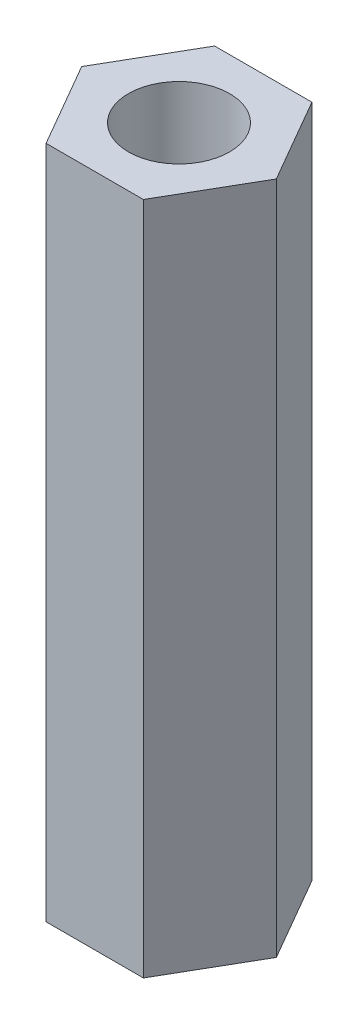
ISO-10303-21;
HEADER;
FILE_DESCRIPTION(('STEP AP214'),'2;1');
FILE_NAME('part.step','',(''),(''),'','','');
FILE_SCHEMA(('AUTOMOTIVE_DESIGN { 1 0 10303 214 1 1 1 1 }'));
ENDSEC;
DATA;
#1=APPLICATION_CONTEXT('core data for automotive mechanical design processes');
#2=APPLICATION_PROTOCOL_DEFINITION('international standard','automotive_design',2000,#1);
#3=PRODUCT_CONTEXT('',#1,'mechanical');
#4=PRODUCT('Part','Part','',(#3));
#5=PRODUCT_RELATED_PRODUCT_CATEGORY('part','',(#4));
#6=PRODUCT_DEFINITION_FORMATION('','',#4);
#7=PRODUCT_DEFINITION_CONTEXT('part definition',#1,'design');
#8=PRODUCT_DEFINITION('design','',#6,#7);
#9=PRODUCT_DEFINITION_SHAPE('','',#8);
#10=(LENGTH_UNIT() NAMED_UNIT(*) SI_UNIT(.MILLI.,.METRE.));
#11=(NAMED_UNIT(*) PLANE_ANGLE_UNIT() SI_UNIT($,.RADIAN.));
#12=(NAMED_UNIT(*) SI_UNIT($,.STERADIAN.) SOLID_ANGLE_UNIT());
#13=UNCERTAINTY_MEASURE_WITH_UNIT(LENGTH_MEASURE(1.E-05),#10,'distance_accuracy_value','');
#14=(GEOMETRIC_REPRESENTATION_CONTEXT(3) GLOBAL_UNCERTAINTY_ASSIGNED_CONTEXT((#13)) GLOBAL_UNIT_ASSIGNED_CONTEXT((#10,
#11,#12)) REPRESENTATION_CONTEXT('',''));
#15=CARTESIAN_POINT('',(0.,0.,0.));
#16=DIRECTION('',(0.,0.,1.));
#17=DIRECTION('',(1.,0.,0.));
#18=AXIS2_PLACEMENT_3D('',#15,#16,#17);
#19=CARTESIAN_POINT('',(0.,20.,0.));
#20=DIRECTION('',(0.,1.,0.));
#21=DIRECTION('',(0.,0.,1.));
#22=AXIS2_PLACEMENT_3D('',#19,#20,#21);
#23=PLANE('',#22);
#24=DIRECTION('',(-0.5,0.,-0.866025403784439));
#25=VECTOR('',#24,1.);
#26=CARTESIAN_POINT('',(2.88675134594813,20.,0.));
#27=LINE('',#26,#25);
#28=CARTESIAN_POINT('',(2.88675134594813,20.,0.));
#29=VERTEX_POINT('',#28);
#30=CARTESIAN_POINT('',(1.44337567297406,20.,-2.5));
#31=VERTEX_POINT('',#30);
#32=EDGE_CURVE('E129',#29,#31,#27,.T.);
#33=ORIENTED_EDGE('',*,*,#32,.T.);
#34=DIRECTION('',(-1.,0.,0.));
#35=VECTOR('',#34,1.);
#36=CARTESIAN_POINT('',(1.44337567297406,20.,-2.5));
#37=LINE('',#36,#35);
#38=CARTESIAN_POINT('',(-1.44337567297406,20.,-2.5));
#39=VERTEX_POINT('',#38);
#40=EDGE_CURVE('E87',#31,#39,#37,.T.);
#41=ORIENTED_EDGE('',*,*,#40,.T.);
#42=DIRECTION('',(-0.5,0.,0.866025403784439));
#43=VECTOR('',#42,1.);
#44=CARTESIAN_POINT('',(-1.44337567297406,20.,-2.5));
#45=LINE('',#44,#43);
#46=CARTESIAN_POINT('',(-2.88675134594813,20.,0.));
#47=VERTEX_POINT('',#46);
#48=EDGE_CURVE('E100',#39,#47,#45,.T.);
#49=ORIENTED_EDGE('',*,*,#48,.T.);
#50=DIRECTION('',(0.5,0.,0.866025403784438));
#51=VECTOR('',#50,1.);
#52=CARTESIAN_POINT('',(-2.88675134594813,20.,0.));
#53=LINE('',#52,#51);
#54=CARTESIAN_POINT('',(-1.44337567297406,20.,2.5));
#55=VERTEX_POINT('',#54);
#56=EDGE_CURVE('E94',#47,#55,#53,.T.);
#57=ORIENTED_EDGE('',*,*,#56,.T.);
#58=DIRECTION('',(1.,0.,0.));
#59=VECTOR('',#58,1.);
#60=CARTESIAN_POINT('',(-1.44337567297406,20.,2.5));
#61=LINE('',#60,#59);
#62=CARTESIAN_POINT('',(1.44337567297406,20.,2.5));
#63=VERTEX_POINT('',#62);
#64=EDGE_CURVE('E98',#55,#63,#61,.T.);
#65=ORIENTED_EDGE('',*,*,#64,.T.);
#66=DIRECTION('',(0.5,0.,-0.866025403784439));
#67=VECTOR('',#66,1.);
#68=CARTESIAN_POINT('',(1.44337567297406,20.,2.5));
#69=LINE('',#68,#67);
#70=EDGE_CURVE('E50',#63,#29,#69,.T.);
#71=ORIENTED_EDGE('',*,*,#70,.T.);
#72=EDGE_LOOP('',(#33,#41,#49,#57,#65,#71));
#73=FACE_BOUND('',#72,.T.);
#74=CARTESIAN_POINT('',(0.,20.,0.));
#75=DIRECTION('',(0.,1.,0.));
#76=DIRECTION('',(0.,0.,1.));
#77=AXIS2_PLACEMENT_3D('',#74,#75,#76);
#78=CIRCLE('',#77,1.5);
#79=CARTESIAN_POINT('',(0.,20.,1.5));
#80=VERTEX_POINT('',#79);
#81=EDGE_CURVE('E122',#80,#80,#78,.T.);
#82=ORIENTED_EDGE('',*,*,#81,.F.);
#83=EDGE_LOOP('',(#82));
#84=FACE_BOUND('',#83,.T.);
#85=ADVANCED_FACE('F33',(#73,#84),#23,.T.);
#86=CARTESIAN_POINT('',(0.,0.,0.));
#87=DIRECTION('',(0.,1.,0.));
#88=DIRECTION('',(0.,0.,1.));
#89=AXIS2_PLACEMENT_3D('',#86,#87,#88);
#90=PLANE('',#89);
#91=DIRECTION('',(-0.5,0.,-0.866025403784439));
#92=VECTOR('',#91,1.);
#93=CARTESIAN_POINT('',(2.88675134594813,0.,0.));
#94=LINE('',#93,#92);
#95=CARTESIAN_POINT('',(2.88675134594813,0.,0.));
#96=VERTEX_POINT('',#95);
#97=CARTESIAN_POINT('',(1.44337567297406,0.,-2.5));
#98=VERTEX_POINT('',#97);
#99=EDGE_CURVE('E118',#96,#98,#94,.T.);
#100=ORIENTED_EDGE('',*,*,#99,.F.);
#101=DIRECTION('',(0.5,0.,-0.866025403784439));
#102=VECTOR('',#101,1.);
#103=CARTESIAN_POINT('',(1.44337567297406,0.,2.5));
#104=LINE('',#103,#102);
#105=CARTESIAN_POINT('',(1.44337567297406,0.,2.5));
#106=VERTEX_POINT('',#105);
#107=EDGE_CURVE('E79',#106,#96,#104,.T.);
#108=ORIENTED_EDGE('',*,*,#107,.F.);
#109=DIRECTION('',(1.,0.,0.));
#110=VECTOR('',#109,1.);
#111=CARTESIAN_POINT('',(-1.44337567297406,0.,2.5));
#112=LINE('',#111,#110);
#113=CARTESIAN_POINT('',(-1.44337567297406,0.,2.5));
#114=VERTEX_POINT('',#113);
#115=EDGE_CURVE('E73',#114,#106,#112,.T.);
#116=ORIENTED_EDGE('',*,*,#115,.F.);
#117=DIRECTION('',(0.5,0.,0.866025403784438));
#118=VECTOR('',#117,1.);
#119=CARTESIAN_POINT('',(-2.88675134594813,0.,0.));
#120=LINE('',#119,#118);
#121=CARTESIAN_POINT('',(-2.88675134594813,0.,0.));
#122=VERTEX_POINT('',#121);
#123=EDGE_CURVE('E108',#122,#114,#120,.T.);
#124=ORIENTED_EDGE('',*,*,#123,.F.);
#125=DIRECTION('',(-0.5,0.,0.866025403784439));
#126=VECTOR('',#125,1.);
#127=CARTESIAN_POINT('',(-1.44337567297406,0.,-2.5));
#128=LINE('',#127,#126);
#129=CARTESIAN_POINT('',(-1.44337567297406,0.,-2.5));
#130=VERTEX_POINT('',#129);
#131=EDGE_CURVE('E124',#130,#122,#128,.T.);
#132=ORIENTED_EDGE('',*,*,#131,.F.);
#133=DIRECTION('',(-1.,0.,0.));
#134=VECTOR('',#133,1.);
#135=CARTESIAN_POINT('',(1.44337567297406,0.,-2.5));
#136=LINE('',#135,#134);
#137=EDGE_CURVE('E121',#98,#130,#136,.T.);
#138=ORIENTED_EDGE('',*,*,#137,.F.);
#139=EDGE_LOOP('',(#100,#108,#116,#124,#132,#138));
#140=FACE_BOUND('',#139,.T.);
#141=CARTESIAN_POINT('',(0.,0.,0.));
#142=DIRECTION('',(0.,1.,0.));
#143=DIRECTION('',(0.,0.,1.));
#144=AXIS2_PLACEMENT_3D('',#141,#142,#143);
#145=CIRCLE('',#144,1.5);
#146=CARTESIAN_POINT('',(0.,0.,1.5));
#147=VERTEX_POINT('',#146);
#148=EDGE_CURVE('E222',#147,#147,#145,.T.);
#149=ORIENTED_EDGE('',*,*,#148,.T.);
#150=EDGE_LOOP('',(#149));
#151=FACE_BOUND('',#150,.T.);
#152=ADVANCED_FACE('F138',(#140,#151),#90,.F.);
#153=CARTESIAN_POINT('',(2.88675134594813,20.,0.));
#154=DIRECTION('',(-0.866025403784438,0.,0.5));
#155=DIRECTION('',(0.5,0.,0.866025403784438));
#156=AXIS2_PLACEMENT_3D('',#153,#154,#155);
#157=PLANE('',#156);
#158=ORIENTED_EDGE('',*,*,#99,.T.);
#159=DIRECTION('',(0.,-1.,0.));
#160=VECTOR('',#159,1.);
#161=CARTESIAN_POINT('',(1.44337567297406,20.,-2.5));
#162=LINE('',#161,#160);
#163=EDGE_CURVE('E11',#31,#98,#162,.T.);
#164=ORIENTED_EDGE('',*,*,#163,.F.);
#165=ORIENTED_EDGE('',*,*,#32,.F.);
#166=DIRECTION('',(0.,-1.,0.));
#167=VECTOR('',#166,1.);
#168=CARTESIAN_POINT('',(2.88675134594813,20.,0.));
#169=LINE('',#168,#167);
#170=EDGE_CURVE('E114',#29,#96,#169,.T.);
#171=ORIENTED_EDGE('',*,*,#170,.T.);
#172=EDGE_LOOP('',(#158,#164,#165,#171));
#173=FACE_BOUND('',#172,.T.);
#174=ADVANCED_FACE('F35',(#173),#157,.F.);
#175=CARTESIAN_POINT('',(1.44337567297406,20.,-2.5));
#176=DIRECTION('',(0.,0.,1.));
#177=DIRECTION('',(1.,0.,0.));
#178=AXIS2_PLACEMENT_3D('',#175,#176,#177);
#179=PLANE('',#178);
#180=ORIENTED_EDGE('',*,*,#137,.T.);
#181=DIRECTION('',(0.,-1.,0.));
#182=VECTOR('',#181,1.);
#183=CARTESIAN_POINT('',(-1.44337567297406,20.,-2.5));
#184=LINE('',#183,#182);
#185=EDGE_CURVE('E42',#39,#130,#184,.T.);
#186=ORIENTED_EDGE('',*,*,#185,.F.);
#187=ORIENTED_EDGE('',*,*,#40,.F.);
#188=ORIENTED_EDGE('',*,*,#163,.T.);
#189=EDGE_LOOP('',(#180,#186,#187,#188));
#190=FACE_BOUND('',#189,.T.);
#191=ADVANCED_FACE('F163',(#190),#179,.F.);
#192=CARTESIAN_POINT('',(-1.44337567297406,20.,-2.5));
#193=DIRECTION('',(0.866025403784439,0.,0.5));
#194=DIRECTION('',(0.5,0.,-0.866025403784439));
#195=AXIS2_PLACEMENT_3D('',#192,#193,#194);
#196=PLANE('',#195);
#197=ORIENTED_EDGE('',*,*,#131,.T.);
#198=DIRECTION('',(0.,-1.,0.));
#199=VECTOR('',#198,1.);
#200=CARTESIAN_POINT('',(-2.88675134594813,20.,0.));
#201=LINE('',#200,#199);
#202=EDGE_CURVE('E109',#47,#122,#201,.T.);
#203=ORIENTED_EDGE('',*,*,#202,.F.);
#204=ORIENTED_EDGE('',*,*,#48,.F.);
#205=ORIENTED_EDGE('',*,*,#185,.T.);
#206=EDGE_LOOP('',(#197,#203,#204,#205));
#207=FACE_BOUND('',#206,.T.);
#208=ADVANCED_FACE('F135',(#207),#196,.F.);
#209=CARTESIAN_POINT('',(-2.88675134594813,20.,0.));
#210=DIRECTION('',(0.866025403784438,0.,-0.5));
#211=DIRECTION('',(-0.5,0.,-0.866025403784438));
#212=AXIS2_PLACEMENT_3D('',#209,#210,#211);
#213=PLANE('',#212);
#214=ORIENTED_EDGE('',*,*,#123,.T.);
#215=DIRECTION('',(0.,-1.,0.));
#216=VECTOR('',#215,1.);
#217=CARTESIAN_POINT('',(-1.44337567297406,20.,2.5));
#218=LINE('',#217,#216);
#219=EDGE_CURVE('E105',#55,#114,#218,.T.);
#220=ORIENTED_EDGE('',*,*,#219,.F.);
#221=ORIENTED_EDGE('',*,*,#56,.F.);
#222=ORIENTED_EDGE('',*,*,#202,.T.);
#223=EDGE_LOOP('',(#214,#220,#221,#222));
#224=FACE_BOUND('',#223,.T.);
#225=ADVANCED_FACE('F106',(#224),#213,.F.);
#226=CARTESIAN_POINT('',(-1.44337567297406,20.,2.5));
#227=DIRECTION('',(0.,0.,-1.));
#228=DIRECTION('',(-1.,0.,0.));
#229=AXIS2_PLACEMENT_3D('',#226,#227,#228);
#230=PLANE('',#229);
#231=ORIENTED_EDGE('',*,*,#115,.T.);
#232=DIRECTION('',(0.,-1.,0.));
#233=VECTOR('',#232,1.);
#234=CARTESIAN_POINT('',(1.44337567297406,20.,2.5));
#235=LINE('',#234,#233);
#236=EDGE_CURVE('E110',#63,#106,#235,.T.);
#237=ORIENTED_EDGE('',*,*,#236,.F.);
#238=ORIENTED_EDGE('',*,*,#64,.F.);
#239=ORIENTED_EDGE('',*,*,#219,.T.);
#240=EDGE_LOOP('',(#231,#237,#238,#239));
#241=FACE_BOUND('',#240,.T.);
#242=ADVANCED_FACE('F112',(#241),#230,.F.);
#243=CARTESIAN_POINT('',(1.44337567297406,20.,2.5));
#244=DIRECTION('',(-0.866025403784439,0.,-0.5));
#245=DIRECTION('',(-0.5,0.,0.866025403784439));
#246=AXIS2_PLACEMENT_3D('',#243,#244,#245);
#247=PLANE('',#246);
#248=ORIENTED_EDGE('',*,*,#107,.T.);
#249=ORIENTED_EDGE('',*,*,#170,.F.);
#250=ORIENTED_EDGE('',*,*,#70,.F.);
#251=ORIENTED_EDGE('',*,*,#236,.T.);
#252=EDGE_LOOP('',(#248,#249,#250,#251));
#253=FACE_BOUND('',#252,.T.);
#254=ADVANCED_FACE('F143',(#253),#247,.F.);
#255=CARTESIAN_POINT('',(0.,20.,0.));
#256=DIRECTION('',(0.,-1.,0.));
#257=DIRECTION('',(0.,0.,-1.));
#258=AXIS2_PLACEMENT_3D('',#255,#256,#257);
#259=CYLINDRICAL_SURFACE('',#258,1.5);
#260=ORIENTED_EDGE('',*,*,#81,.T.);
#261=EDGE_LOOP('',(#260));
#262=FACE_BOUND('',#261,.T.);
#263=ORIENTED_EDGE('',*,*,#148,.F.);
#264=EDGE_LOOP('',(#263));
#265=FACE_BOUND('',#264,.T.);
#266=ADVANCED_FACE('F145',(#262,#265),#259,.F.);
#267=CLOSED_SHELL('',(#85,#152,#174,#191,#208,#225,#242,#254,#266));
#268=MANIFOLD_SOLID_BREP('B2',#267);
#269=ADVANCED_BREP_SHAPE_REPRESENTATION('',(#18,#268),#14);
#270=SHAPE_DEFINITION_REPRESENTATION(#9,#269);
ENDSEC;
END-ISO-10303-21;
